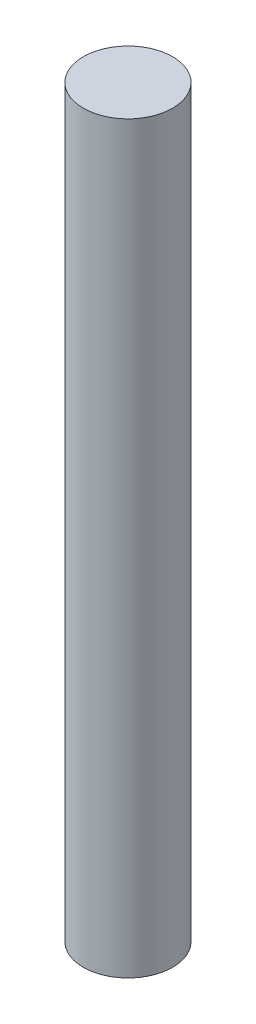
ISO-10303-21;
HEADER;
FILE_DESCRIPTION(('STEP AP214'),'2;1');
FILE_NAME('part.step','',(''),(''),'','','');
FILE_SCHEMA(('AUTOMOTIVE_DESIGN { 1 0 10303 214 1 1 1 1 }'));
ENDSEC;
DATA;
#1=APPLICATION_CONTEXT('core data for automotive mechanical design processes');
#2=APPLICATION_PROTOCOL_DEFINITION('international standard','automotive_design',2000,#1);
#3=PRODUCT_CONTEXT('',#1,'mechanical');
#4=PRODUCT('Part','Part','',(#3));
#5=PRODUCT_RELATED_PRODUCT_CATEGORY('part','',(#4));
#6=PRODUCT_DEFINITION_FORMATION('','',#4);
#7=PRODUCT_DEFINITION_CONTEXT('part definition',#1,'design');
#8=PRODUCT_DEFINITION('design','',#6,#7);
#9=PRODUCT_DEFINITION_SHAPE('','',#8);
#10=(LENGTH_UNIT() NAMED_UNIT(*) SI_UNIT(.MILLI.,.METRE.));
#11=(NAMED_UNIT(*) PLANE_ANGLE_UNIT() SI_UNIT($,.RADIAN.));
#12=(NAMED_UNIT(*) SI_UNIT($,.STERADIAN.) SOLID_ANGLE_UNIT());
#13=UNCERTAINTY_MEASURE_WITH_UNIT(LENGTH_MEASURE(1.E-05),#10,'distance_accuracy_value','');
#14=(GEOMETRIC_REPRESENTATION_CONTEXT(3) GLOBAL_UNCERTAINTY_ASSIGNED_CONTEXT((#13)) GLOBAL_UNIT_ASSIGNED_CONTEXT((#10,
#11,#12)) REPRESENTATION_CONTEXT('',''));
#15=CARTESIAN_POINT('',(0.,0.,0.));
#16=DIRECTION('',(0.,0.,1.));
#17=DIRECTION('',(1.,0.,0.));
#18=AXIS2_PLACEMENT_3D('',#15,#16,#17);
#19=CARTESIAN_POINT('',(0.,25.4,0.));
#20=DIRECTION('',(0.,-1.,0.));
#21=DIRECTION('',(0.,0.,-1.));
#22=AXIS2_PLACEMENT_3D('',#19,#20,#21);
#23=CYLINDRICAL_SURFACE('',#22,1.524);
#24=CARTESIAN_POINT('',(0.,25.4,0.));
#25=DIRECTION('',(0.,1.,0.));
#26=DIRECTION('',(0.,0.,1.));
#27=AXIS2_PLACEMENT_3D('',#24,#25,#26);
#28=CIRCLE('',#27,1.524);
#29=CARTESIAN_POINT('',(0.,25.4,1.524));
#30=VERTEX_POINT('',#29);
#31=EDGE_CURVE('E10',#30,#30,#28,.T.);
#32=ORIENTED_EDGE('',*,*,#31,.F.);
#33=EDGE_LOOP('',(#32));
#34=FACE_BOUND('',#33,.T.);
#35=CARTESIAN_POINT('',(0.,0.,0.));
#36=DIRECTION('',(0.,1.,0.));
#37=DIRECTION('',(0.,0.,1.));
#38=AXIS2_PLACEMENT_3D('',#35,#36,#37);
#39=CIRCLE('',#38,1.524);
#40=CARTESIAN_POINT('',(0.,0.,1.524));
#41=VERTEX_POINT('',#40);
#42=EDGE_CURVE('E33',#41,#41,#39,.T.);
#43=ORIENTED_EDGE('',*,*,#42,.T.);
#44=EDGE_LOOP('',(#43));
#45=FACE_BOUND('',#44,.T.);
#46=ADVANCED_FACE('F30',(#34,#45),#23,.T.);
#47=CARTESIAN_POINT('',(0.,25.4,0.));
#48=DIRECTION('',(0.,1.,0.));
#49=DIRECTION('',(0.,0.,1.));
#50=AXIS2_PLACEMENT_3D('',#47,#48,#49);
#51=PLANE('',#50);
#52=ORIENTED_EDGE('',*,*,#31,.T.);
#53=EDGE_LOOP('',(#52));
#54=FACE_BOUND('',#53,.T.);
#55=ADVANCED_FACE('F45',(#54),#51,.T.);
#56=CARTESIAN_POINT('',(0.,0.,0.));
#57=DIRECTION('',(0.,1.,0.));
#58=DIRECTION('',(0.,0.,1.));
#59=AXIS2_PLACEMENT_3D('',#56,#57,#58);
#60=PLANE('',#59);
#61=ORIENTED_EDGE('',*,*,#42,.F.);
#62=EDGE_LOOP('',(#61));
#63=FACE_BOUND('',#62,.T.);
#64=ADVANCED_FACE('F43',(#63),#60,.F.);
#65=CLOSED_SHELL('',(#46,#55,#64));
#66=MANIFOLD_SOLID_BREP('B2',#65);
#67=ADVANCED_BREP_SHAPE_REPRESENTATION('',(#18,#66),#14);
#68=SHAPE_DEFINITION_REPRESENTATION(#9,#67);
ENDSEC;
END-ISO-10303-21;
